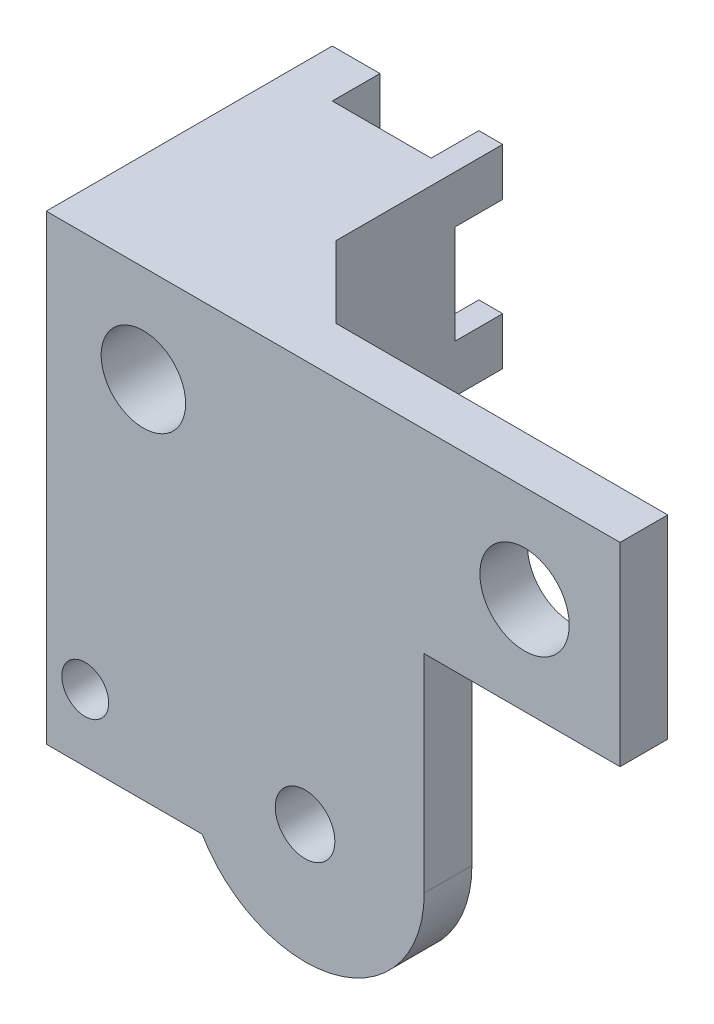
ISO-10303-21;
HEADER;
FILE_DESCRIPTION(('STEP AP214'),'2;1');
FILE_NAME('part.step','',(''),(''),'','','');
FILE_SCHEMA(('AUTOMOTIVE_DESIGN { 1 0 10303 214 1 1 1 1 }'));
ENDSEC;
DATA;
#1=APPLICATION_CONTEXT('core data for automotive mechanical design processes');
#2=APPLICATION_PROTOCOL_DEFINITION('international standard','automotive_design',2000,#1);
#3=PRODUCT_CONTEXT('',#1,'mechanical');
#4=PRODUCT('Part','Part','',(#3));
#5=PRODUCT_RELATED_PRODUCT_CATEGORY('part','',(#4));
#6=PRODUCT_DEFINITION_FORMATION('','',#4);
#7=PRODUCT_DEFINITION_CONTEXT('part definition',#1,'design');
#8=PRODUCT_DEFINITION('design','',#6,#7);
#9=PRODUCT_DEFINITION_SHAPE('','',#8);
#10=(LENGTH_UNIT() NAMED_UNIT(*) SI_UNIT(.MILLI.,.METRE.));
#11=(NAMED_UNIT(*) PLANE_ANGLE_UNIT() SI_UNIT($,.RADIAN.));
#12=(NAMED_UNIT(*) SI_UNIT($,.STERADIAN.) SOLID_ANGLE_UNIT());
#13=UNCERTAINTY_MEASURE_WITH_UNIT(LENGTH_MEASURE(1.E-05),#10,'distance_accuracy_value','');
#14=(GEOMETRIC_REPRESENTATION_CONTEXT(3) GLOBAL_UNCERTAINTY_ASSIGNED_CONTEXT((#13)) GLOBAL_UNIT_ASSIGNED_CONTEXT((#10,
#11,#12)) REPRESENTATION_CONTEXT('',''));
#15=CARTESIAN_POINT('',(0.,0.,0.));
#16=DIRECTION('',(0.,0.,1.));
#17=DIRECTION('',(1.,0.,0.));
#18=AXIS2_PLACEMENT_3D('',#15,#16,#17);
#19=CARTESIAN_POINT('',(0.,20.701,-25.4));
#20=DIRECTION('',(0.,0.,-1.));
#21=DIRECTION('',(-1.,0.,0.));
#22=AXIS2_PLACEMENT_3D('',#19,#20,#21);
#23=PLANE('',#22);
#24=CARTESIAN_POINT('',(10.3505,10.3505,-25.4));
#25=DIRECTION('',(0.,0.,-1.));
#26=DIRECTION('',(-1.,0.,0.));
#27=AXIS2_PLACEMENT_3D('',#24,#25,#26);
#28=CIRCLE('',#27,4.5);
#29=CARTESIAN_POINT('',(5.8505,10.3505,-25.4));
#30=VERTEX_POINT('',#29);
#31=EDGE_CURVE('E234',#30,#30,#28,.T.);
#32=ORIENTED_EDGE('',*,*,#31,.F.);
#33=EDGE_LOOP('',(#32));
#34=FACE_BOUND('',#33,.T.);
#35=DIRECTION('',(0.,1.,0.));
#36=VECTOR('',#35,1.);
#37=CARTESIAN_POINT('',(18.161,20.701,-25.4));
#38=LINE('',#37,#36);
#39=CARTESIAN_POINT('',(18.161,5.08,-25.4));
#40=VERTEX_POINT('',#39);
#41=CARTESIAN_POINT('',(18.161,15.621,-25.4));
#42=VERTEX_POINT('',#41);
#43=EDGE_CURVE('E264',#40,#42,#38,.T.);
#44=ORIENTED_EDGE('',*,*,#43,.F.);
#45=DIRECTION('',(1.,0.,0.));
#46=VECTOR('',#45,1.);
#47=CARTESIAN_POINT('',(20.701,5.08,-25.4));
#48=LINE('',#47,#46);
#49=CARTESIAN_POINT('',(15.621,5.08,-25.4));
#50=VERTEX_POINT('',#49);
#51=EDGE_CURVE('E274',#50,#40,#48,.T.);
#52=ORIENTED_EDGE('',*,*,#51,.F.);
#53=DIRECTION('',(0.,1.,0.));
#54=VECTOR('',#53,1.);
#55=CARTESIAN_POINT('',(15.621,0.,-25.4));
#56=LINE('',#55,#54);
#57=CARTESIAN_POINT('',(15.621,0.,-25.4));
#58=VERTEX_POINT('',#57);
#59=EDGE_CURVE('E270',#58,#50,#56,.T.);
#60=ORIENTED_EDGE('',*,*,#59,.F.);
#61=DIRECTION('',(1.,0.,0.));
#62=VECTOR('',#61,1.);
#63=CARTESIAN_POINT('',(0.,0.,-25.4));
#64=LINE('',#63,#62);
#65=CARTESIAN_POINT('',(5.08,0.,-25.4));
#66=VERTEX_POINT('',#65);
#67=EDGE_CURVE('E389',#66,#58,#64,.T.);
#68=ORIENTED_EDGE('',*,*,#67,.F.);
#69=DIRECTION('',(0.,-1.,0.));
#70=VECTOR('',#69,1.);
#71=CARTESIAN_POINT('',(5.08,0.,-25.4));
#72=LINE('',#71,#70);
#73=CARTESIAN_POINT('',(5.08,5.08,-25.4));
#74=VERTEX_POINT('',#73);
#75=EDGE_CURVE('E335',#74,#66,#72,.T.);
#76=ORIENTED_EDGE('',*,*,#75,.F.);
#77=DIRECTION('',(1.,0.,0.));
#78=VECTOR('',#77,1.);
#79=CARTESIAN_POINT('',(0.,5.08,-25.4));
#80=LINE('',#79,#78);
#81=CARTESIAN_POINT('',(0.,5.08,-25.4));
#82=VERTEX_POINT('',#81);
#83=EDGE_CURVE('E330',#82,#74,#80,.T.);
#84=ORIENTED_EDGE('',*,*,#83,.F.);
#85=DIRECTION('',(0.,-1.,0.));
#86=VECTOR('',#85,1.);
#87=CARTESIAN_POINT('',(0.,20.701,-25.4));
#88=LINE('',#87,#86);
#89=CARTESIAN_POINT('',(0.,15.621,-25.4));
#90=VERTEX_POINT('',#89);
#91=EDGE_CURVE('E402',#90,#82,#88,.T.);
#92=ORIENTED_EDGE('',*,*,#91,.F.);
#93=DIRECTION('',(-1.,0.,0.));
#94=VECTOR('',#93,1.);
#95=CARTESIAN_POINT('',(0.,15.621,-25.4));
#96=LINE('',#95,#94);
#97=CARTESIAN_POINT('',(5.08,15.621,-25.4));
#98=VERTEX_POINT('',#97);
#99=EDGE_CURVE('E311',#98,#90,#96,.T.);
#100=ORIENTED_EDGE('',*,*,#99,.F.);
#101=DIRECTION('',(0.,-1.,0.));
#102=VECTOR('',#101,1.);
#103=CARTESIAN_POINT('',(5.08,20.701,-25.4));
#104=LINE('',#103,#102);
#105=CARTESIAN_POINT('',(5.08,20.701,-25.4));
#106=VERTEX_POINT('',#105);
#107=EDGE_CURVE('E306',#106,#98,#104,.T.);
#108=ORIENTED_EDGE('',*,*,#107,.F.);
#109=DIRECTION('',(1.,0.,0.));
#110=VECTOR('',#109,1.);
#111=CARTESIAN_POINT('',(0.,20.701,-25.4));
#112=LINE('',#111,#110);
#113=CARTESIAN_POINT('',(15.621,20.701,-25.4));
#114=VERTEX_POINT('',#113);
#115=EDGE_CURVE('E376',#106,#114,#112,.T.);
#116=ORIENTED_EDGE('',*,*,#115,.T.);
#117=DIRECTION('',(0.,1.,0.));
#118=VECTOR('',#117,1.);
#119=CARTESIAN_POINT('',(15.621,20.701,-25.4));
#120=LINE('',#119,#118);
#121=CARTESIAN_POINT('',(15.621,15.621,-25.4));
#122=VERTEX_POINT('',#121);
#123=EDGE_CURVE('E293',#122,#114,#120,.T.);
#124=ORIENTED_EDGE('',*,*,#123,.F.);
#125=DIRECTION('',(-1.,0.,0.));
#126=VECTOR('',#125,1.);
#127=CARTESIAN_POINT('',(20.701,15.621,-25.4));
#128=LINE('',#127,#126);
#129=EDGE_CURVE('E289',#42,#122,#128,.T.);
#130=ORIENTED_EDGE('',*,*,#129,.F.);
#131=EDGE_LOOP('',(#44,#52,#60,#68,#76,#84,#92,#100,#108,#116,#124,#130));
#132=FACE_BOUND('',#131,.T.);
#133=ADVANCED_FACE('F51',(#34,#132),#23,.T.);
#134=CARTESIAN_POINT('',(0.,0.,0.));
#135=DIRECTION('',(0.,1.,0.));
#136=DIRECTION('',(0.,0.,1.));
#137=AXIS2_PLACEMENT_3D('',#134,#135,#136);
#138=PLANE('',#137);
#139=DIRECTION('',(-1.,0.,0.));
#140=VECTOR('',#139,1.);
#141=CARTESIAN_POINT('',(0.,0.,-5.07999999999999));
#142=LINE('',#141,#140);
#143=CARTESIAN_POINT('',(61.1505,0.,-5.08));
#144=VERTEX_POINT('',#143);
#145=CARTESIAN_POINT('',(40.280941282,0.,-5.08));
#146=VERTEX_POINT('',#145);
#147=EDGE_CURVE('E377',#144,#146,#142,.T.);
#148=ORIENTED_EDGE('',*,*,#147,.F.);
#149=DIRECTION('',(0.,0.,-1.));
#150=VECTOR('',#149,1.);
#151=CARTESIAN_POINT('',(61.1505,0.,0.));
#152=LINE('',#151,#150);
#153=CARTESIAN_POINT('',(61.1505,0.,0.));
#154=VERTEX_POINT('',#153);
#155=EDGE_CURVE('E253',#154,#144,#152,.T.);
#156=ORIENTED_EDGE('',*,*,#155,.F.);
#157=DIRECTION('',(1.,0.,0.));
#158=VECTOR('',#157,1.);
#159=CARTESIAN_POINT('',(0.,0.,0.));
#160=LINE('',#159,#158);
#161=CARTESIAN_POINT('',(40.280941282,0.,0.));
#162=VERTEX_POINT('',#161);
#163=EDGE_CURVE('E394',#162,#154,#160,.T.);
#164=ORIENTED_EDGE('',*,*,#163,.F.);
#165=DIRECTION('',(0.,0.,1.));
#166=VECTOR('',#165,1.);
#167=CARTESIAN_POINT('',(40.280941282,0.,-5.08));
#168=LINE('',#167,#166);
#169=EDGE_CURVE('E368',#146,#162,#168,.T.);
#170=ORIENTED_EDGE('',*,*,#169,.F.);
#171=EDGE_LOOP('',(#148,#156,#164,#170));
#172=FACE_BOUND('',#171,.T.);
#173=ADVANCED_FACE('F449',(#172),#138,.F.);
#174=DIRECTION('',(0.,0.,1.));
#175=VECTOR('',#174,1.);
#176=CARTESIAN_POINT('',(18.161,0.,0.));
#177=LINE('',#176,#175);
#178=CARTESIAN_POINT('',(18.161,0.,-30.48));
#179=VERTEX_POINT('',#178);
#180=CARTESIAN_POINT('',(18.161,0.,-12.7176640489122));
#181=VERTEX_POINT('',#180);
#182=EDGE_CURVE('E76',#179,#181,#177,.T.);
#183=ORIENTED_EDGE('',*,*,#182,.T.);
#184=DIRECTION('',(0.704652336597845,0.,0.709552735550499));
#185=VECTOR('',#184,1.);
#186=CARTESIAN_POINT('',(15.5021087241352,0.,-15.3950461852293));
#187=LINE('',#186,#185);
#188=CARTESIAN_POINT('',(20.701,0.,-10.16));
#189=VERTEX_POINT('',#188);
#190=EDGE_CURVE('E228',#181,#189,#187,.T.);
#191=ORIENTED_EDGE('',*,*,#190,.T.);
#192=DIRECTION('',(0.707106781186547,0.,0.707106781186548));
#193=VECTOR('',#192,1.);
#194=CARTESIAN_POINT('',(15.4305,0.,-15.4305));
#195=LINE('',#194,#193);
#196=CARTESIAN_POINT('',(25.781,0.,-5.07999999999999));
#197=VERTEX_POINT('',#196);
#198=EDGE_CURVE('E370',#189,#197,#195,.T.);
#199=ORIENTED_EDGE('',*,*,#198,.T.);
#200=DIRECTION('',(1.,0.,0.));
#201=VECTOR('',#200,1.);
#202=CARTESIAN_POINT('',(0.,0.,-5.08));
#203=LINE('',#202,#201);
#204=CARTESIAN_POINT('',(0.,0.,-5.08));
#205=VERTEX_POINT('',#204);
#206=EDGE_CURVE('E361',#205,#197,#203,.T.);
#207=ORIENTED_EDGE('',*,*,#206,.F.);
#208=DIRECTION('',(0.,0.,-1.));
#209=VECTOR('',#208,1.);
#210=CARTESIAN_POINT('',(0.,0.,0.));
#211=LINE('',#210,#209);
#212=CARTESIAN_POINT('',(0.,0.,-30.48));
#213=VERTEX_POINT('',#212);
#214=EDGE_CURVE('E392',#205,#213,#211,.T.);
#215=ORIENTED_EDGE('',*,*,#214,.T.);
#216=DIRECTION('',(-1.,0.,0.));
#217=VECTOR('',#216,1.);
#218=CARTESIAN_POINT('',(0.,0.,-30.48));
#219=LINE('',#218,#217);
#220=CARTESIAN_POINT('',(5.08,0.,-30.48));
#221=VERTEX_POINT('',#220);
#222=EDGE_CURVE('E339',#221,#213,#219,.T.);
#223=ORIENTED_EDGE('',*,*,#222,.F.);
#224=DIRECTION('',(0.,0.,1.));
#225=VECTOR('',#224,1.);
#226=CARTESIAN_POINT('',(5.08,0.,-30.48));
#227=LINE('',#226,#225);
#228=EDGE_CURVE('E342',#221,#66,#227,.T.);
#229=ORIENTED_EDGE('',*,*,#228,.T.);
#230=ORIENTED_EDGE('',*,*,#67,.T.);
#231=DIRECTION('',(0.,0.,1.));
#232=VECTOR('',#231,1.);
#233=CARTESIAN_POINT('',(15.621,0.,-30.48));
#234=LINE('',#233,#232);
#235=CARTESIAN_POINT('',(15.621,0.,-30.48));
#236=VERTEX_POINT('',#235);
#237=EDGE_CURVE('E286',#236,#58,#234,.T.);
#238=ORIENTED_EDGE('',*,*,#237,.F.);
#239=DIRECTION('',(-1.,0.,0.));
#240=VECTOR('',#239,1.);
#241=CARTESIAN_POINT('',(20.701,0.,-30.48));
#242=LINE('',#241,#240);
#243=EDGE_CURVE('E271',#179,#236,#242,.T.);
#244=ORIENTED_EDGE('',*,*,#243,.F.);
#245=EDGE_LOOP('',(#183,#191,#199,#207,#215,#223,#229,#230,#238,#244));
#246=FACE_BOUND('',#245,.T.);
#247=ADVANCED_FACE('F486',(#246),#138,.F.);
#248=CARTESIAN_POINT('',(15.4305,20.701,-15.4305));
#249=DIRECTION('',(0.707106781186548,0.,-0.707106781186547));
#250=DIRECTION('',(-0.707106781186547,0.,-0.707106781186548));
#251=AXIS2_PLACEMENT_3D('',#248,#249,#250);
#252=PLANE('',#251);
#253=ORIENTED_EDGE('',*,*,#198,.F.);
#254=DIRECTION('',(0.,-1.,0.));
#255=VECTOR('',#254,1.);
#256=CARTESIAN_POINT('',(20.701,20.701,-10.16));
#257=LINE('',#256,#255);
#258=CARTESIAN_POINT('',(20.701,20.701,-10.16));
#259=VERTEX_POINT('',#258);
#260=EDGE_CURVE('E60',#259,#189,#257,.T.);
#261=ORIENTED_EDGE('',*,*,#260,.F.);
#262=DIRECTION('',(0.707106781186547,0.,0.707106781186548));
#263=VECTOR('',#262,1.);
#264=CARTESIAN_POINT('',(15.4305,20.701,-15.4305));
#265=LINE('',#264,#263);
#266=CARTESIAN_POINT('',(25.781,20.701,-5.07999999999999));
#267=VERTEX_POINT('',#266);
#268=EDGE_CURVE('E233',#259,#267,#265,.T.);
#269=ORIENTED_EDGE('',*,*,#268,.T.);
#270=DIRECTION('',(0.,-1.,0.));
#271=VECTOR('',#270,1.);
#272=CARTESIAN_POINT('',(25.781,20.701,-5.07999999999999));
#273=LINE('',#272,#271);
#274=EDGE_CURVE('E386',#267,#197,#273,.T.);
#275=ORIENTED_EDGE('',*,*,#274,.T.);
#276=EDGE_LOOP('',(#253,#261,#269,#275));
#277=FACE_BOUND('',#276,.T.);
#278=ADVANCED_FACE('F53',(#277),#252,.T.);
#279=CARTESIAN_POINT('',(0.,20.701,0.));
#280=DIRECTION('',(-1.,0.,0.));
#281=DIRECTION('',(0.,0.,1.));
#282=AXIS2_PLACEMENT_3D('',#279,#280,#281);
#283=PLANE('',#282);
#284=ORIENTED_EDGE('',*,*,#214,.F.);
#285=DIRECTION('',(0.,1.,0.));
#286=VECTOR('',#285,1.);
#287=CARTESIAN_POINT('',(0.,0.,-5.08));
#288=LINE('',#287,#286);
#289=CARTESIAN_POINT('',(0.,-28.4936006593936,-5.08));
#290=VERTEX_POINT('',#289);
#291=EDGE_CURVE('E243',#290,#205,#288,.T.);
#292=ORIENTED_EDGE('',*,*,#291,.F.);
#293=DIRECTION('',(0.,0.,1.));
#294=VECTOR('',#293,1.);
#295=CARTESIAN_POINT('',(0.,-28.4936006593936,-5.08));
#296=LINE('',#295,#294);
#297=CARTESIAN_POINT('',(0.,-28.4936006593936,0.));
#298=VERTEX_POINT('',#297);
#299=EDGE_CURVE('E248',#290,#298,#296,.T.);
#300=ORIENTED_EDGE('',*,*,#299,.T.);
#301=DIRECTION('',(0.,-1.,0.));
#302=VECTOR('',#301,1.);
#303=CARTESIAN_POINT('',(0.,20.701,0.));
#304=LINE('',#303,#302);
#305=CARTESIAN_POINT('',(0.,20.701,0.));
#306=VERTEX_POINT('',#305);
#307=EDGE_CURVE('E400',#306,#298,#304,.T.);
#308=ORIENTED_EDGE('',*,*,#307,.F.);
#309=DIRECTION('',(0.,0.,-1.));
#310=VECTOR('',#309,1.);
#311=CARTESIAN_POINT('',(0.,20.701,0.));
#312=LINE('',#311,#310);
#313=CARTESIAN_POINT('',(0.,20.701,-30.48));
#314=VERTEX_POINT('',#313);
#315=EDGE_CURVE('E379',#306,#314,#312,.T.);
#316=ORIENTED_EDGE('',*,*,#315,.T.);
#317=DIRECTION('',(0.,1.,0.));
#318=VECTOR('',#317,1.);
#319=CARTESIAN_POINT('',(0.,20.701,-30.48));
#320=LINE('',#319,#318);
#321=CARTESIAN_POINT('',(0.,15.621,-30.48));
#322=VERTEX_POINT('',#321);
#323=EDGE_CURVE('E307',#322,#314,#320,.T.);
#324=ORIENTED_EDGE('',*,*,#323,.F.);
#325=DIRECTION('',(0.,0.,1.));
#326=VECTOR('',#325,1.);
#327=CARTESIAN_POINT('',(0.,15.621,-30.48));
#328=LINE('',#327,#326);
#329=EDGE_CURVE('E317',#322,#90,#328,.T.);
#330=ORIENTED_EDGE('',*,*,#329,.T.);
#331=ORIENTED_EDGE('',*,*,#91,.T.);
#332=DIRECTION('',(0.,0.,1.));
#333=VECTOR('',#332,1.);
#334=CARTESIAN_POINT('',(0.,5.08,-30.48));
#335=LINE('',#334,#333);
#336=CARTESIAN_POINT('',(0.,5.08,-30.48));
#337=VERTEX_POINT('',#336);
#338=EDGE_CURVE('E350',#337,#82,#335,.T.);
#339=ORIENTED_EDGE('',*,*,#338,.F.);
#340=DIRECTION('',(0.,1.,0.));
#341=VECTOR('',#340,1.);
#342=CARTESIAN_POINT('',(0.,0.,-30.48));
#343=LINE('',#342,#341);
#344=EDGE_CURVE('E331',#213,#337,#343,.T.);
#345=ORIENTED_EDGE('',*,*,#344,.F.);
#346=EDGE_LOOP('',(#284,#292,#300,#308,#316,#324,#330,#331,#339,#345));
#347=FACE_BOUND('',#346,.T.);
#348=ADVANCED_FACE('F435',(#347),#283,.T.);
#349=CARTESIAN_POINT('',(0.,20.701,0.));
#350=DIRECTION('',(0.,0.,-1.));
#351=DIRECTION('',(-1.,0.,0.));
#352=AXIS2_PLACEMENT_3D('',#349,#350,#351);
#353=PLANE('',#352);
#354=CARTESIAN_POINT('',(4.15221813811711,-21.3702004945452,0.));
#355=DIRECTION('',(0.,0.,1.));
#356=DIRECTION('',(1.,0.,0.));
#357=AXIS2_PLACEMENT_3D('',#354,#355,#356);
#358=CIRCLE('',#357,2.5);
#359=CARTESIAN_POINT('',(6.65221813811711,-21.3702004945452,0.));
#360=VERTEX_POINT('',#359);
#361=EDGE_CURVE('E422',#360,#360,#358,.T.);
#362=ORIENTED_EDGE('',*,*,#361,.F.);
#363=EDGE_LOOP('',(#362));
#364=FACE_BOUND('',#363,.T.);
#365=CARTESIAN_POINT('',(50.970999912,10.3505,0.));
#366=DIRECTION('',(0.,0.,1.));
#367=DIRECTION('',(1.,0.,0.));
#368=AXIS2_PLACEMENT_3D('',#365,#366,#367);
#369=CIRCLE('',#368,4.7625);
#370=CARTESIAN_POINT('',(55.733499912,10.3505,0.));
#371=VERTEX_POINT('',#370);
#372=EDGE_CURVE('E421',#371,#371,#369,.T.);
#373=ORIENTED_EDGE('',*,*,#372,.F.);
#374=EDGE_LOOP('',(#373));
#375=FACE_BOUND('',#374,.T.);
#376=CARTESIAN_POINT('',(27.580941282,-22.098,0.));
#377=DIRECTION('',(0.,0.,1.));
#378=DIRECTION('',(1.,0.,0.));
#379=AXIS2_PLACEMENT_3D('',#376,#377,#378);
#380=CIRCLE('',#379,3.175);
#381=CARTESIAN_POINT('',(30.755941282,-22.098,0.));
#382=VERTEX_POINT('',#381);
#383=EDGE_CURVE('E408',#382,#382,#380,.T.);
#384=ORIENTED_EDGE('',*,*,#383,.F.);
#385=EDGE_LOOP('',(#384));
#386=FACE_BOUND('',#385,.T.);
#387=CARTESIAN_POINT('',(10.3505,10.3505,0.));
#388=DIRECTION('',(0.,0.,1.));
#389=DIRECTION('',(1.,0.,0.));
#390=AXIS2_PLACEMENT_3D('',#387,#388,#389);
#391=CIRCLE('',#390,4.5);
#392=CARTESIAN_POINT('',(14.8505,10.3505,0.));
#393=VERTEX_POINT('',#392);
#394=EDGE_CURVE('E237',#393,#393,#391,.T.);
#395=ORIENTED_EDGE('',*,*,#394,.F.);
#396=EDGE_LOOP('',(#395));
#397=FACE_BOUND('',#396,.T.);
#398=ORIENTED_EDGE('',*,*,#163,.T.);
#399=DIRECTION('',(0.,-1.,0.));
#400=VECTOR('',#399,1.);
#401=CARTESIAN_POINT('',(61.1505,20.701,0.));
#402=LINE('',#401,#400);
#403=CARTESIAN_POINT('',(61.1505,20.701,0.));
#404=VERTEX_POINT('',#403);
#405=EDGE_CURVE('E256',#404,#154,#402,.T.);
#406=ORIENTED_EDGE('',*,*,#405,.F.);
#407=DIRECTION('',(1.,0.,0.));
#408=VECTOR('',#407,1.);
#409=CARTESIAN_POINT('',(0.,20.701,0.));
#410=LINE('',#409,#408);
#411=EDGE_CURVE('E381',#306,#404,#410,.T.);
#412=ORIENTED_EDGE('',*,*,#411,.F.);
#413=ORIENTED_EDGE('',*,*,#307,.T.);
#414=DIRECTION('',(-1.,0.,0.));
#415=VECTOR('',#414,1.);
#416=CARTESIAN_POINT('',(0.,-28.4936006593936,0.));
#417=LINE('',#416,#415);
#418=CARTESIAN_POINT('',(16.6088725524684,-28.4936006593936,0.));
#419=VERTEX_POINT('',#418);
#420=EDGE_CURVE('E242',#419,#298,#417,.T.);
#421=ORIENTED_EDGE('',*,*,#420,.F.);
#422=CARTESIAN_POINT('',(27.580941282,-22.098,0.));
#423=DIRECTION('',(0.,0.,1.));
#424=DIRECTION('',(1.,0.,0.));
#425=AXIS2_PLACEMENT_3D('',#422,#423,#424);
#426=CIRCLE('',#425,12.7);
#427=CARTESIAN_POINT('',(40.280941282,-22.098,0.));
#428=VERTEX_POINT('',#427);
#429=EDGE_CURVE('E353',#419,#428,#426,.T.);
#430=ORIENTED_EDGE('',*,*,#429,.T.);
#431=DIRECTION('',(0.,1.,0.));
#432=VECTOR('',#431,1.);
#433=CARTESIAN_POINT('',(40.280941282,0.,0.));
#434=LINE('',#433,#432);
#435=EDGE_CURVE('E358',#428,#162,#434,.T.);
#436=ORIENTED_EDGE('',*,*,#435,.T.);
#437=EDGE_LOOP('',(#398,#406,#412,#413,#421,#430,#436));
#438=FACE_BOUND('',#437,.T.);
#439=ADVANCED_FACE('F431',(#364,#375,#386,#397,#438),#353,.F.);
#440=CARTESIAN_POINT('',(0.,20.701,-5.07999999999999));
#441=DIRECTION('',(0.,0.,1.));
#442=DIRECTION('',(1.,0.,0.));
#443=AXIS2_PLACEMENT_3D('',#440,#441,#442);
#444=PLANE('',#443);
#445=CARTESIAN_POINT('',(4.15221813811711,-21.3702004945452,-5.07999999999999));
#446=DIRECTION('',(0.,0.,1.));
#447=DIRECTION('',(1.,0.,0.));
#448=AXIS2_PLACEMENT_3D('',#445,#446,#447);
#449=CIRCLE('',#448,2.5);
#450=CARTESIAN_POINT('',(6.65221813811711,-21.3702004945452,-5.07999999999999));
#451=VERTEX_POINT('',#450);
#452=EDGE_CURVE('E55',#451,#451,#449,.T.);
#453=ORIENTED_EDGE('',*,*,#452,.T.);
#454=EDGE_LOOP('',(#453));
#455=FACE_BOUND('',#454,.T.);
#456=CARTESIAN_POINT('',(50.970999912,10.3505,-5.07999999999999));
#457=DIRECTION('',(0.,0.,1.));
#458=DIRECTION('',(1.,0.,0.));
#459=AXIS2_PLACEMENT_3D('',#456,#457,#458);
#460=CIRCLE('',#459,4.7625);
#461=CARTESIAN_POINT('',(55.733499912,10.3505,-5.07999999999999));
#462=VERTEX_POINT('',#461);
#463=EDGE_CURVE('E407',#462,#462,#460,.T.);
#464=ORIENTED_EDGE('',*,*,#463,.T.);
#465=EDGE_LOOP('',(#464));
#466=FACE_BOUND('',#465,.T.);
#467=CARTESIAN_POINT('',(27.580941282,-22.098,-5.07999999999999));
#468=DIRECTION('',(0.,0.,1.));
#469=DIRECTION('',(1.,0.,0.));
#470=AXIS2_PLACEMENT_3D('',#467,#468,#469);
#471=CIRCLE('',#470,3.175);
#472=CARTESIAN_POINT('',(30.755941282,-22.098,-5.07999999999999));
#473=VERTEX_POINT('',#472);
#474=EDGE_CURVE('E405',#473,#473,#471,.T.);
#475=ORIENTED_EDGE('',*,*,#474,.T.);
#476=EDGE_LOOP('',(#475));
#477=FACE_BOUND('',#476,.T.);
#478=DIRECTION('',(-1.,0.,0.));
#479=VECTOR('',#478,1.);
#480=CARTESIAN_POINT('',(0.,20.701,-5.07999999999999));
#481=LINE('',#480,#479);
#482=CARTESIAN_POINT('',(61.1505,20.701,-5.08));
#483=VERTEX_POINT('',#482);
#484=EDGE_CURVE('E384',#483,#267,#481,.T.);
#485=ORIENTED_EDGE('',*,*,#484,.F.);
#486=DIRECTION('',(0.,-1.,0.));
#487=VECTOR('',#486,1.);
#488=CARTESIAN_POINT('',(61.1505,20.701,-5.08));
#489=LINE('',#488,#487);
#490=EDGE_CURVE('E68',#483,#144,#489,.T.);
#491=ORIENTED_EDGE('',*,*,#490,.T.);
#492=ORIENTED_EDGE('',*,*,#147,.T.);
#493=DIRECTION('',(0.,1.,0.));
#494=VECTOR('',#493,1.);
#495=CARTESIAN_POINT('',(40.280941282,0.,-5.08));
#496=LINE('',#495,#494);
#497=CARTESIAN_POINT('',(40.280941282,-22.098,-5.08));
#498=VERTEX_POINT('',#497);
#499=EDGE_CURVE('E357',#498,#146,#496,.T.);
#500=ORIENTED_EDGE('',*,*,#499,.F.);
#501=CARTESIAN_POINT('',(27.580941282,-22.098,-5.08));
#502=DIRECTION('',(0.,0.,1.));
#503=DIRECTION('',(1.,0.,0.));
#504=AXIS2_PLACEMENT_3D('',#501,#502,#503);
#505=CIRCLE('',#504,12.7);
#506=CARTESIAN_POINT('',(16.6088725524684,-28.4936006593936,-5.08));
#507=VERTEX_POINT('',#506);
#508=EDGE_CURVE('E354',#507,#498,#505,.T.);
#509=ORIENTED_EDGE('',*,*,#508,.F.);
#510=DIRECTION('',(-1.,0.,0.));
#511=VECTOR('',#510,1.);
#512=CARTESIAN_POINT('',(0.,-28.4936006593936,-5.08));
#513=LINE('',#512,#511);
#514=EDGE_CURVE('E246',#507,#290,#513,.T.);
#515=ORIENTED_EDGE('',*,*,#514,.T.);
#516=ORIENTED_EDGE('',*,*,#291,.T.);
#517=ORIENTED_EDGE('',*,*,#206,.T.);
#518=ORIENTED_EDGE('',*,*,#274,.F.);
#519=EDGE_LOOP('',(#485,#491,#492,#500,#509,#515,#516,#517,#518));
#520=FACE_BOUND('',#519,.T.);
#521=ADVANCED_FACE('F434',(#455,#466,#477,#520),#444,.F.);
#522=CARTESIAN_POINT('',(0.,20.701,0.));
#523=DIRECTION('',(0.,1.,0.));
#524=DIRECTION('',(0.,0.,1.));
#525=AXIS2_PLACEMENT_3D('',#522,#523,#524);
#526=PLANE('',#525);
#527=DIRECTION('',(0.704652336597845,0.,0.709552735550499));
#528=VECTOR('',#527,1.);
#529=CARTESIAN_POINT('',(18.161,20.701,-12.7176640489122));
#530=LINE('',#529,#528);
#531=CARTESIAN_POINT('',(18.161,20.701,-12.7176640489122));
#532=VERTEX_POINT('',#531);
#533=EDGE_CURVE('E225',#532,#259,#530,.T.);
#534=ORIENTED_EDGE('',*,*,#533,.F.);
#535=DIRECTION('',(0.,0.,1.));
#536=VECTOR('',#535,1.);
#537=CARTESIAN_POINT('',(18.161,20.701,-30.48));
#538=LINE('',#537,#536);
#539=CARTESIAN_POINT('',(18.161,20.701,-30.48));
#540=VERTEX_POINT('',#539);
#541=EDGE_CURVE('E211',#540,#532,#538,.T.);
#542=ORIENTED_EDGE('',*,*,#541,.F.);
#543=DIRECTION('',(1.,0.,0.));
#544=VECTOR('',#543,1.);
#545=CARTESIAN_POINT('',(20.701,20.701,-30.48));
#546=LINE('',#545,#544);
#547=CARTESIAN_POINT('',(15.621,20.701,-30.48));
#548=VERTEX_POINT('',#547);
#549=EDGE_CURVE('E295',#548,#540,#546,.T.);
#550=ORIENTED_EDGE('',*,*,#549,.F.);
#551=DIRECTION('',(0.,0.,1.));
#552=VECTOR('',#551,1.);
#553=CARTESIAN_POINT('',(15.621,20.701,-30.48));
#554=LINE('',#553,#552);
#555=EDGE_CURVE('E297',#548,#114,#554,.T.);
#556=ORIENTED_EDGE('',*,*,#555,.T.);
#557=ORIENTED_EDGE('',*,*,#115,.F.);
#558=DIRECTION('',(0.,0.,1.));
#559=VECTOR('',#558,1.);
#560=CARTESIAN_POINT('',(5.08,20.701,-30.48));
#561=LINE('',#560,#559);
#562=CARTESIAN_POINT('',(5.08,20.701,-30.48));
#563=VERTEX_POINT('',#562);
#564=EDGE_CURVE('E327',#563,#106,#561,.T.);
#565=ORIENTED_EDGE('',*,*,#564,.F.);
#566=DIRECTION('',(1.,0.,0.));
#567=VECTOR('',#566,1.);
#568=CARTESIAN_POINT('',(0.,20.701,-30.48));
#569=LINE('',#568,#567);
#570=EDGE_CURVE('E310',#314,#563,#569,.T.);
#571=ORIENTED_EDGE('',*,*,#570,.F.);
#572=ORIENTED_EDGE('',*,*,#315,.F.);
#573=ORIENTED_EDGE('',*,*,#411,.T.);
#574=DIRECTION('',(0.,0.,-1.));
#575=VECTOR('',#574,1.);
#576=CARTESIAN_POINT('',(61.1505,20.701,0.));
#577=LINE('',#576,#575);
#578=EDGE_CURVE('E254',#404,#483,#577,.T.);
#579=ORIENTED_EDGE('',*,*,#578,.T.);
#580=ORIENTED_EDGE('',*,*,#484,.T.);
#581=ORIENTED_EDGE('',*,*,#268,.F.);
#582=EDGE_LOOP('',(#534,#542,#550,#556,#557,#565,#571,#572,#573,#579,#580,#581));
#583=FACE_BOUND('',#582,.T.);
#584=ADVANCED_FACE('F231',(#583),#526,.T.);
#585=CARTESIAN_POINT('',(40.280941282,0.,-5.08));
#586=DIRECTION('',(1.,0.,0.));
#587=DIRECTION('',(0.,0.,-1.));
#588=AXIS2_PLACEMENT_3D('',#585,#586,#587);
#589=PLANE('',#588);
#590=ORIENTED_EDGE('',*,*,#435,.F.);
#591=DIRECTION('',(0.,0.,1.));
#592=VECTOR('',#591,1.);
#593=CARTESIAN_POINT('',(40.280941282,-22.098,-5.08));
#594=LINE('',#593,#592);
#595=EDGE_CURVE('E371',#498,#428,#594,.T.);
#596=ORIENTED_EDGE('',*,*,#595,.F.);
#597=ORIENTED_EDGE('',*,*,#499,.T.);
#598=ORIENTED_EDGE('',*,*,#169,.T.);
#599=EDGE_LOOP('',(#590,#596,#597,#598));
#600=FACE_BOUND('',#599,.T.);
#601=ADVANCED_FACE('F470',(#600),#589,.T.);
#602=CARTESIAN_POINT('',(27.580941282,-22.098,-5.08));
#603=DIRECTION('',(0.,0.,1.));
#604=DIRECTION('',(1.,0.,0.));
#605=AXIS2_PLACEMENT_3D('',#602,#603,#604);
#606=CYLINDRICAL_SURFACE('',#605,12.7);
#607=ORIENTED_EDGE('',*,*,#429,.F.);
#608=DIRECTION('',(0.,0.,1.));
#609=VECTOR('',#608,1.);
#610=CARTESIAN_POINT('',(16.6088725524684,-28.4936006593936,-5.08));
#611=LINE('',#610,#609);
#612=EDGE_CURVE('E363',#507,#419,#611,.T.);
#613=ORIENTED_EDGE('',*,*,#612,.F.);
#614=ORIENTED_EDGE('',*,*,#508,.T.);
#615=ORIENTED_EDGE('',*,*,#595,.T.);
#616=EDGE_LOOP('',(#607,#613,#614,#615));
#617=FACE_BOUND('',#616,.T.);
#618=ADVANCED_FACE('F468',(#617),#606,.T.);
#619=CARTESIAN_POINT('',(0.,5.08,-30.48));
#620=DIRECTION('',(0.,-1.,0.));
#621=DIRECTION('',(0.,0.,-1.));
#622=AXIS2_PLACEMENT_3D('',#619,#620,#621);
#623=PLANE('',#622);
#624=ORIENTED_EDGE('',*,*,#83,.T.);
#625=DIRECTION('',(0.,0.,1.));
#626=VECTOR('',#625,1.);
#627=CARTESIAN_POINT('',(5.08,5.08,-30.48));
#628=LINE('',#627,#626);
#629=CARTESIAN_POINT('',(5.08,5.08,-30.48));
#630=VERTEX_POINT('',#629);
#631=EDGE_CURVE('E347',#630,#74,#628,.T.);
#632=ORIENTED_EDGE('',*,*,#631,.F.);
#633=DIRECTION('',(1.,0.,0.));
#634=VECTOR('',#633,1.);
#635=CARTESIAN_POINT('',(0.,5.08,-30.48));
#636=LINE('',#635,#634);
#637=EDGE_CURVE('E334',#337,#630,#636,.T.);
#638=ORIENTED_EDGE('',*,*,#637,.F.);
#639=ORIENTED_EDGE('',*,*,#338,.T.);
#640=EDGE_LOOP('',(#624,#632,#638,#639));
#641=FACE_BOUND('',#640,.T.);
#642=ADVANCED_FACE('F477',(#641),#623,.F.);
#643=CARTESIAN_POINT('',(5.08,0.,-30.48));
#644=DIRECTION('',(-1.,0.,0.));
#645=DIRECTION('',(0.,0.,1.));
#646=AXIS2_PLACEMENT_3D('',#643,#644,#645);
#647=PLANE('',#646);
#648=ORIENTED_EDGE('',*,*,#75,.T.);
#649=ORIENTED_EDGE('',*,*,#228,.F.);
#650=DIRECTION('',(0.,-1.,0.));
#651=VECTOR('',#650,1.);
#652=CARTESIAN_POINT('',(5.08,0.,-30.48));
#653=LINE('',#652,#651);
#654=EDGE_CURVE('E337',#630,#221,#653,.T.);
#655=ORIENTED_EDGE('',*,*,#654,.F.);
#656=ORIENTED_EDGE('',*,*,#631,.T.);
#657=EDGE_LOOP('',(#648,#649,#655,#656));
#658=FACE_BOUND('',#657,.T.);
#659=ADVANCED_FACE('F561',(#658),#647,.F.);
#660=CARTESIAN_POINT('',(0.,0.,-30.48));
#661=DIRECTION('',(0.,0.,-1.));
#662=DIRECTION('',(-1.,0.,0.));
#663=AXIS2_PLACEMENT_3D('',#660,#661,#662);
#664=PLANE('',#663);
#665=ORIENTED_EDGE('',*,*,#344,.T.);
#666=ORIENTED_EDGE('',*,*,#637,.T.);
#667=ORIENTED_EDGE('',*,*,#654,.T.);
#668=ORIENTED_EDGE('',*,*,#222,.T.);
#669=EDGE_LOOP('',(#665,#666,#667,#668));
#670=FACE_BOUND('',#669,.T.);
#671=ADVANCED_FACE('F557',(#670),#664,.T.);
#672=CARTESIAN_POINT('',(5.08,20.701,-30.48));
#673=DIRECTION('',(-1.,0.,0.));
#674=DIRECTION('',(0.,-1.,0.));
#675=AXIS2_PLACEMENT_3D('',#672,#673,#674);
#676=PLANE('',#675);
#677=ORIENTED_EDGE('',*,*,#107,.T.);
#678=DIRECTION('',(0.,0.,1.));
#679=VECTOR('',#678,1.);
#680=CARTESIAN_POINT('',(5.08,15.621,-30.48));
#681=LINE('',#680,#679);
#682=CARTESIAN_POINT('',(5.08,15.621,-30.48));
#683=VERTEX_POINT('',#682);
#684=EDGE_CURVE('E324',#683,#98,#681,.T.);
#685=ORIENTED_EDGE('',*,*,#684,.F.);
#686=DIRECTION('',(0.,-1.,0.));
#687=VECTOR('',#686,1.);
#688=CARTESIAN_POINT('',(5.08,20.701,-30.48));
#689=LINE('',#688,#687);
#690=EDGE_CURVE('E313',#563,#683,#689,.T.);
#691=ORIENTED_EDGE('',*,*,#690,.F.);
#692=ORIENTED_EDGE('',*,*,#564,.T.);
#693=EDGE_LOOP('',(#677,#685,#691,#692));
#694=FACE_BOUND('',#693,.T.);
#695=ADVANCED_FACE('F553',(#694),#676,.F.);
#696=CARTESIAN_POINT('',(0.,15.621,-30.48));
#697=DIRECTION('',(0.,1.,0.));
#698=DIRECTION('',(0.,0.,1.));
#699=AXIS2_PLACEMENT_3D('',#696,#697,#698);
#700=PLANE('',#699);
#701=ORIENTED_EDGE('',*,*,#99,.T.);
#702=ORIENTED_EDGE('',*,*,#329,.F.);
#703=DIRECTION('',(-1.,0.,0.));
#704=VECTOR('',#703,1.);
#705=CARTESIAN_POINT('',(0.,15.621,-30.48));
#706=LINE('',#705,#704);
#707=EDGE_CURVE('E315',#683,#322,#706,.T.);
#708=ORIENTED_EDGE('',*,*,#707,.F.);
#709=ORIENTED_EDGE('',*,*,#684,.T.);
#710=EDGE_LOOP('',(#701,#702,#708,#709));
#711=FACE_BOUND('',#710,.T.);
#712=ADVANCED_FACE('F549',(#711),#700,.F.);
#713=CARTESIAN_POINT('',(0.,0.,-30.48));
#714=DIRECTION('',(0.,0.,1.));
#715=DIRECTION('',(1.,0.,0.));
#716=AXIS2_PLACEMENT_3D('',#713,#714,#715);
#717=PLANE('',#716);
#718=ORIENTED_EDGE('',*,*,#323,.T.);
#719=ORIENTED_EDGE('',*,*,#570,.T.);
#720=ORIENTED_EDGE('',*,*,#690,.T.);
#721=ORIENTED_EDGE('',*,*,#707,.T.);
#722=EDGE_LOOP('',(#718,#719,#720,#721));
#723=FACE_BOUND('',#722,.T.);
#724=ADVANCED_FACE('F545',(#723),#717,.F.);
#725=CARTESIAN_POINT('',(20.701,15.621,-30.48));
#726=DIRECTION('',(0.,1.,0.));
#727=DIRECTION('',(0.,0.,1.));
#728=AXIS2_PLACEMENT_3D('',#725,#726,#727);
#729=PLANE('',#728);
#730=DIRECTION('',(-1.,0.,0.));
#731=VECTOR('',#730,1.);
#732=CARTESIAN_POINT('',(20.701,15.621,-30.48));
#733=LINE('',#732,#731);
#734=CARTESIAN_POINT('',(18.161,15.621,-30.48));
#735=VERTEX_POINT('',#734);
#736=CARTESIAN_POINT('',(15.621,15.621,-30.48));
#737=VERTEX_POINT('',#736);
#738=EDGE_CURVE('E290',#735,#737,#733,.T.);
#739=ORIENTED_EDGE('',*,*,#738,.F.);
#740=DIRECTION('',(0.,0.,1.));
#741=VECTOR('',#740,1.);
#742=CARTESIAN_POINT('',(18.161,15.621,-30.48));
#743=LINE('',#742,#741);
#744=EDGE_CURVE('E266',#735,#42,#743,.T.);
#745=ORIENTED_EDGE('',*,*,#744,.T.);
#746=ORIENTED_EDGE('',*,*,#129,.T.);
#747=DIRECTION('',(0.,0.,1.));
#748=VECTOR('',#747,1.);
#749=CARTESIAN_POINT('',(15.621,15.621,-30.48));
#750=LINE('',#749,#748);
#751=EDGE_CURVE('E303',#737,#122,#750,.T.);
#752=ORIENTED_EDGE('',*,*,#751,.F.);
#753=EDGE_LOOP('',(#739,#745,#746,#752));
#754=FACE_BOUND('',#753,.T.);
#755=ADVANCED_FACE('F541',(#754),#729,.F.);
#756=CARTESIAN_POINT('',(15.621,20.701,-30.48));
#757=DIRECTION('',(1.,0.,0.));
#758=DIRECTION('',(0.,0.,-1.));
#759=AXIS2_PLACEMENT_3D('',#756,#757,#758);
#760=PLANE('',#759);
#761=ORIENTED_EDGE('',*,*,#123,.T.);
#762=ORIENTED_EDGE('',*,*,#555,.F.);
#763=DIRECTION('',(0.,1.,0.));
#764=VECTOR('',#763,1.);
#765=CARTESIAN_POINT('',(15.621,20.701,-30.48));
#766=LINE('',#765,#764);
#767=EDGE_CURVE('E292',#737,#548,#766,.T.);
#768=ORIENTED_EDGE('',*,*,#767,.F.);
#769=ORIENTED_EDGE('',*,*,#751,.T.);
#770=EDGE_LOOP('',(#761,#762,#768,#769));
#771=FACE_BOUND('',#770,.T.);
#772=ADVANCED_FACE('F537',(#771),#760,.F.);
#773=CARTESIAN_POINT('',(0.,0.,-30.48));
#774=DIRECTION('',(0.,0.,-1.));
#775=DIRECTION('',(-1.,0.,0.));
#776=AXIS2_PLACEMENT_3D('',#773,#774,#775);
#777=PLANE('',#776);
#778=DIRECTION('',(0.,1.,0.));
#779=VECTOR('',#778,1.);
#780=CARTESIAN_POINT('',(18.161,-34.798,-30.48));
#781=LINE('',#780,#779);
#782=EDGE_CURVE('E216',#735,#540,#781,.T.);
#783=ORIENTED_EDGE('',*,*,#782,.F.);
#784=ORIENTED_EDGE('',*,*,#738,.T.);
#785=ORIENTED_EDGE('',*,*,#767,.T.);
#786=ORIENTED_EDGE('',*,*,#549,.T.);
#787=EDGE_LOOP('',(#783,#784,#785,#786));
#788=FACE_BOUND('',#787,.T.);
#789=ADVANCED_FACE('F533',(#788),#777,.T.);
#790=CARTESIAN_POINT('',(15.621,0.,-30.48));
#791=DIRECTION('',(1.,0.,0.));
#792=DIRECTION('',(0.,0.,-1.));
#793=AXIS2_PLACEMENT_3D('',#790,#791,#792);
#794=PLANE('',#793);
#795=ORIENTED_EDGE('',*,*,#59,.T.);
#796=DIRECTION('',(0.,0.,1.));
#797=VECTOR('',#796,1.);
#798=CARTESIAN_POINT('',(15.621,5.08,-30.48));
#799=LINE('',#798,#797);
#800=CARTESIAN_POINT('',(15.621,5.08,-30.48));
#801=VERTEX_POINT('',#800);
#802=EDGE_CURVE('E279',#801,#50,#799,.T.);
#803=ORIENTED_EDGE('',*,*,#802,.F.);
#804=DIRECTION('',(0.,1.,0.));
#805=VECTOR('',#804,1.);
#806=CARTESIAN_POINT('',(15.621,0.,-30.48));
#807=LINE('',#806,#805);
#808=EDGE_CURVE('E273',#236,#801,#807,.T.);
#809=ORIENTED_EDGE('',*,*,#808,.F.);
#810=ORIENTED_EDGE('',*,*,#237,.T.);
#811=EDGE_LOOP('',(#795,#803,#809,#810));
#812=FACE_BOUND('',#811,.T.);
#813=ADVANCED_FACE('F529',(#812),#794,.F.);
#814=CARTESIAN_POINT('',(20.701,5.08,-30.48));
#815=DIRECTION('',(0.,-1.,0.));
#816=DIRECTION('',(0.,0.,-1.));
#817=AXIS2_PLACEMENT_3D('',#814,#815,#816);
#818=PLANE('',#817);
#819=ORIENTED_EDGE('',*,*,#51,.T.);
#820=DIRECTION('',(0.,0.,-1.));
#821=VECTOR('',#820,1.);
#822=CARTESIAN_POINT('',(18.161,5.08,-30.48));
#823=LINE('',#822,#821);
#824=CARTESIAN_POINT('',(18.161,5.08,-30.48));
#825=VERTEX_POINT('',#824);
#826=EDGE_CURVE('E261',#40,#825,#823,.T.);
#827=ORIENTED_EDGE('',*,*,#826,.T.);
#828=DIRECTION('',(1.,0.,0.));
#829=VECTOR('',#828,1.);
#830=CARTESIAN_POINT('',(20.701,5.08,-30.48));
#831=LINE('',#830,#829);
#832=EDGE_CURVE('E276',#801,#825,#831,.T.);
#833=ORIENTED_EDGE('',*,*,#832,.F.);
#834=ORIENTED_EDGE('',*,*,#802,.T.);
#835=EDGE_LOOP('',(#819,#827,#833,#834));
#836=FACE_BOUND('',#835,.T.);
#837=ADVANCED_FACE('F525',(#836),#818,.F.);
#838=CARTESIAN_POINT('',(0.,0.,-30.48));
#839=DIRECTION('',(0.,0.,1.));
#840=DIRECTION('',(1.,0.,0.));
#841=AXIS2_PLACEMENT_3D('',#838,#839,#840);
#842=PLANE('',#841);
#843=ORIENTED_EDGE('',*,*,#832,.T.);
#844=DIRECTION('',(0.,-1.,0.));
#845=VECTOR('',#844,1.);
#846=CARTESIAN_POINT('',(18.161,0.,-30.48));
#847=LINE('',#846,#845);
#848=EDGE_CURVE('E12',#825,#179,#847,.T.);
#849=ORIENTED_EDGE('',*,*,#848,.T.);
#850=ORIENTED_EDGE('',*,*,#243,.T.);
#851=ORIENTED_EDGE('',*,*,#808,.T.);
#852=EDGE_LOOP('',(#843,#849,#850,#851));
#853=FACE_BOUND('',#852,.T.);
#854=ADVANCED_FACE('F522',(#853),#842,.F.);
#855=CARTESIAN_POINT('',(18.161,-34.798,-30.48));
#856=DIRECTION('',(-1.,0.,0.));
#857=DIRECTION('',(0.,0.,1.));
#858=AXIS2_PLACEMENT_3D('',#855,#856,#857);
#859=PLANE('',#858);
#860=ORIENTED_EDGE('',*,*,#848,.F.);
#861=ORIENTED_EDGE('',*,*,#826,.F.);
#862=ORIENTED_EDGE('',*,*,#43,.T.);
#863=ORIENTED_EDGE('',*,*,#744,.F.);
#864=ORIENTED_EDGE('',*,*,#782,.T.);
#865=ORIENTED_EDGE('',*,*,#541,.T.);
#866=DIRECTION('',(0.,1.,0.));
#867=VECTOR('',#866,1.);
#868=CARTESIAN_POINT('',(18.161,-9.299,-12.7176640489122));
#869=LINE('',#868,#867);
#870=EDGE_CURVE('E214',#181,#532,#869,.T.);
#871=ORIENTED_EDGE('',*,*,#870,.F.);
#872=ORIENTED_EDGE('',*,*,#182,.F.);
#873=EDGE_LOOP('',(#860,#861,#862,#863,#864,#865,#871,#872));
#874=FACE_BOUND('',#873,.T.);
#875=ADVANCED_FACE('F213',(#874),#859,.F.);
#876=CARTESIAN_POINT('',(61.1505,20.701,0.));
#877=DIRECTION('',(-1.,0.,0.));
#878=DIRECTION('',(0.,0.,1.));
#879=AXIS2_PLACEMENT_3D('',#876,#877,#878);
#880=PLANE('',#879);
#881=ORIENTED_EDGE('',*,*,#578,.F.);
#882=ORIENTED_EDGE('',*,*,#405,.T.);
#883=ORIENTED_EDGE('',*,*,#155,.T.);
#884=ORIENTED_EDGE('',*,*,#490,.F.);
#885=EDGE_LOOP('',(#881,#882,#883,#884));
#886=FACE_BOUND('',#885,.T.);
#887=ADVANCED_FACE('F450',(#886),#880,.F.);
#888=CARTESIAN_POINT('',(0.,-28.4936006593936,-5.08));
#889=DIRECTION('',(0.,1.,0.));
#890=DIRECTION('',(0.,0.,1.));
#891=AXIS2_PLACEMENT_3D('',#888,#889,#890);
#892=PLANE('',#891);
#893=ORIENTED_EDGE('',*,*,#420,.T.);
#894=ORIENTED_EDGE('',*,*,#299,.F.);
#895=ORIENTED_EDGE('',*,*,#514,.F.);
#896=ORIENTED_EDGE('',*,*,#612,.T.);
#897=EDGE_LOOP('',(#893,#894,#895,#896));
#898=FACE_BOUND('',#897,.T.);
#899=ADVANCED_FACE('F461',(#898),#892,.F.);
#900=CARTESIAN_POINT('',(18.161,-9.299,-12.7176640489122));
#901=DIRECTION('',(-0.709552735550499,0.,0.704652336597845));
#902=DIRECTION('',(0.704652336597845,0.,0.709552735550499));
#903=AXIS2_PLACEMENT_3D('',#900,#901,#902);
#904=PLANE('',#903);
#905=ORIENTED_EDGE('',*,*,#870,.T.);
#906=ORIENTED_EDGE('',*,*,#533,.T.);
#907=ORIENTED_EDGE('',*,*,#260,.T.);
#908=ORIENTED_EDGE('',*,*,#190,.F.);
#909=EDGE_LOOP('',(#905,#906,#907,#908));
#910=FACE_BOUND('',#909,.T.);
#911=ADVANCED_FACE('F224',(#910),#904,.F.);
#912=CARTESIAN_POINT('',(10.3505,10.3505,-40.));
#913=DIRECTION('',(0.,0.,1.));
#914=DIRECTION('',(1.,0.,0.));
#915=AXIS2_PLACEMENT_3D('',#912,#913,#914);
#916=CYLINDRICAL_SURFACE('',#915,4.5);
#917=ORIENTED_EDGE('',*,*,#31,.T.);
#918=EDGE_LOOP('',(#917));
#919=FACE_BOUND('',#918,.T.);
#920=ORIENTED_EDGE('',*,*,#394,.T.);
#921=EDGE_LOOP('',(#920));
#922=FACE_BOUND('',#921,.T.);
#923=ADVANCED_FACE('F501',(#919,#922),#916,.F.);
#924=CARTESIAN_POINT('',(27.580941282,-22.098,-40.));
#925=DIRECTION('',(0.,0.,1.));
#926=DIRECTION('',(1.,0.,0.));
#927=AXIS2_PLACEMENT_3D('',#924,#925,#926);
#928=CYLINDRICAL_SURFACE('',#927,3.175);
#929=ORIENTED_EDGE('',*,*,#383,.T.);
#930=EDGE_LOOP('',(#929));
#931=FACE_BOUND('',#930,.T.);
#932=ORIENTED_EDGE('',*,*,#474,.F.);
#933=EDGE_LOOP('',(#932));
#934=FACE_BOUND('',#933,.T.);
#935=ADVANCED_FACE('F499',(#931,#934),#928,.F.);
#936=CARTESIAN_POINT('',(50.970999912,10.3505,-40.));
#937=DIRECTION('',(0.,0.,1.));
#938=DIRECTION('',(1.,0.,0.));
#939=AXIS2_PLACEMENT_3D('',#936,#937,#938);
#940=CYLINDRICAL_SURFACE('',#939,4.7625);
#941=ORIENTED_EDGE('',*,*,#372,.T.);
#942=EDGE_LOOP('',(#941));
#943=FACE_BOUND('',#942,.T.);
#944=ORIENTED_EDGE('',*,*,#463,.F.);
#945=EDGE_LOOP('',(#944));
#946=FACE_BOUND('',#945,.T.);
#947=ADVANCED_FACE('F428',(#943,#946),#940,.F.);
#948=CARTESIAN_POINT('',(4.15221813811711,-21.3702004945452,-40.));
#949=DIRECTION('',(0.,0.,1.));
#950=DIRECTION('',(1.,0.,0.));
#951=AXIS2_PLACEMENT_3D('',#948,#949,#950);
#952=CYLINDRICAL_SURFACE('',#951,2.5);
#953=ORIENTED_EDGE('',*,*,#361,.T.);
#954=EDGE_LOOP('',(#953));
#955=FACE_BOUND('',#954,.T.);
#956=ORIENTED_EDGE('',*,*,#452,.F.);
#957=EDGE_LOOP('',(#956));
#958=FACE_BOUND('',#957,.T.);
#959=ADVANCED_FACE('F508',(#955,#958),#952,.F.);
#960=CLOSED_SHELL('',(#133,#173,#247,#278,#348,#439,#521,#584,#601,#618,#642,#659,#671,#695,
#712,#724,#755,#772,#789,#813,#837,#854,#875,#887,#899,#911,#923,#935,#947,#959));
#961=MANIFOLD_SOLID_BREP('B2',#960);
#962=ADVANCED_BREP_SHAPE_REPRESENTATION('',(#18,#961),#14);
#963=SHAPE_DEFINITION_REPRESENTATION(#9,#962);
ENDSEC;
END-ISO-10303-21;
